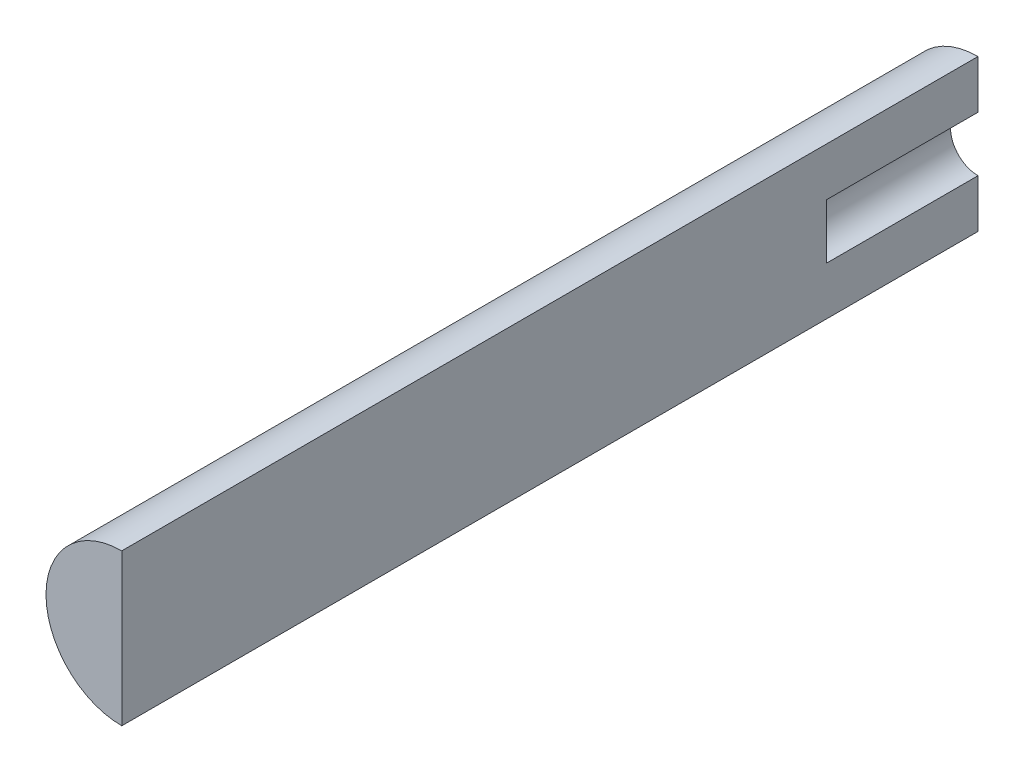
ISO-10303-21;
HEADER;
FILE_DESCRIPTION(('STEP AP214'),'2;1');
FILE_NAME('part.step','',(''),(''),'','','');
FILE_SCHEMA(('AUTOMOTIVE_DESIGN { 1 0 10303 214 1 1 1 1 }'));
ENDSEC;
DATA;
#1=APPLICATION_CONTEXT('core data for automotive mechanical design processes');
#2=APPLICATION_PROTOCOL_DEFINITION('international standard','automotive_design',2000,#1);
#3=PRODUCT_CONTEXT('',#1,'mechanical');
#4=PRODUCT('Part','Part','',(#3));
#5=PRODUCT_RELATED_PRODUCT_CATEGORY('part','',(#4));
#6=PRODUCT_DEFINITION_FORMATION('','',#4);
#7=PRODUCT_DEFINITION_CONTEXT('part definition',#1,'design');
#8=PRODUCT_DEFINITION('design','',#6,#7);
#9=PRODUCT_DEFINITION_SHAPE('','',#8);
#10=(LENGTH_UNIT() NAMED_UNIT(*) SI_UNIT(.MILLI.,.METRE.));
#11=(NAMED_UNIT(*) PLANE_ANGLE_UNIT() SI_UNIT($,.RADIAN.));
#12=(NAMED_UNIT(*) SI_UNIT($,.STERADIAN.) SOLID_ANGLE_UNIT());
#13=UNCERTAINTY_MEASURE_WITH_UNIT(LENGTH_MEASURE(1.E-05),#10,'distance_accuracy_value','');
#14=(GEOMETRIC_REPRESENTATION_CONTEXT(3) GLOBAL_UNCERTAINTY_ASSIGNED_CONTEXT((#13)) GLOBAL_UNIT_ASSIGNED_CONTEXT((#10,
#11,#12)) REPRESENTATION_CONTEXT('',''));
#15=CARTESIAN_POINT('',(0.,0.,0.));
#16=DIRECTION('',(0.,0.,1.));
#17=DIRECTION('',(1.,0.,0.));
#18=AXIS2_PLACEMENT_3D('',#15,#16,#17);
#19=CARTESIAN_POINT('',(0.,0.,45.2));
#20=DIRECTION('',(0.,0.,-1.));
#21=DIRECTION('',(-1.,0.,0.));
#22=AXIS2_PLACEMENT_3D('',#19,#20,#21);
#23=CYLINDRICAL_SURFACE('',#22,4.);
#24=CARTESIAN_POINT('',(0.,0.,45.2));
#25=DIRECTION('',(0.,0.,1.));
#26=DIRECTION('',(1.,0.,0.));
#27=AXIS2_PLACEMENT_3D('',#24,#25,#26);
#28=CIRCLE('',#27,4.);
#29=CARTESIAN_POINT('',(0.,4.,45.2));
#30=VERTEX_POINT('',#29);
#31=CARTESIAN_POINT('',(0.,-4.,45.2));
#32=VERTEX_POINT('',#31);
#33=EDGE_CURVE('E43',#30,#32,#28,.T.);
#34=ORIENTED_EDGE('',*,*,#33,.F.);
#35=DIRECTION('',(0.,0.,-1.));
#36=VECTOR('',#35,1.);
#37=CARTESIAN_POINT('',(0.,4.,60.));
#38=LINE('',#37,#36);
#39=CARTESIAN_POINT('',(0.,4.,0.));
#40=VERTEX_POINT('',#39);
#41=EDGE_CURVE('E80',#30,#40,#38,.T.);
#42=ORIENTED_EDGE('',*,*,#41,.T.);
#43=CARTESIAN_POINT('',(0.,0.,0.));
#44=DIRECTION('',(0.,0.,1.));
#45=DIRECTION('',(1.,0.,0.));
#46=AXIS2_PLACEMENT_3D('',#43,#44,#45);
#47=CIRCLE('',#46,4.);
#48=CARTESIAN_POINT('',(0.,-4.,0.));
#49=VERTEX_POINT('',#48);
#50=EDGE_CURVE('E87',#40,#49,#47,.T.);
#51=ORIENTED_EDGE('',*,*,#50,.T.);
#52=DIRECTION('',(0.,0.,-1.));
#53=VECTOR('',#52,1.);
#54=CARTESIAN_POINT('',(0.,-4.,60.));
#55=LINE('',#54,#53);
#56=EDGE_CURVE('E70',#32,#49,#55,.T.);
#57=ORIENTED_EDGE('',*,*,#56,.F.);
#58=EDGE_LOOP('',(#34,#42,#51,#57));
#59=FACE_BOUND('',#58,.T.);
#60=ADVANCED_FACE('F36',(#59),#23,.T.);
#61=CARTESIAN_POINT('',(0.,0.,45.2));
#62=DIRECTION('',(0.,0.,1.));
#63=DIRECTION('',(1.,0.,0.));
#64=AXIS2_PLACEMENT_3D('',#61,#62,#63);
#65=PLANE('',#64);
#66=DIRECTION('',(0.,-1.,0.));
#67=VECTOR('',#66,1.);
#68=CARTESIAN_POINT('',(0.,0.,45.2));
#69=LINE('',#68,#67);
#70=EDGE_CURVE('E75',#30,#32,#69,.T.);
#71=ORIENTED_EDGE('',*,*,#70,.F.);
#72=ORIENTED_EDGE('',*,*,#33,.T.);
#73=EDGE_LOOP('',(#71,#72));
#74=FACE_BOUND('',#73,.T.);
#75=ADVANCED_FACE('F117',(#74),#65,.T.);
#76=CARTESIAN_POINT('',(0.,0.,0.));
#77=DIRECTION('',(0.,0.,1.));
#78=DIRECTION('',(1.,0.,0.));
#79=AXIS2_PLACEMENT_3D('',#76,#77,#78);
#80=PLANE('',#79);
#81=ORIENTED_EDGE('',*,*,#50,.F.);
#82=DIRECTION('',(0.,1.,0.));
#83=VECTOR('',#82,1.);
#84=CARTESIAN_POINT('',(0.,-4.,0.));
#85=LINE('',#84,#83);
#86=CARTESIAN_POINT('',(0.,1.45,0.));
#87=VERTEX_POINT('',#86);
#88=EDGE_CURVE('E90',#87,#40,#85,.T.);
#89=ORIENTED_EDGE('',*,*,#88,.F.);
#90=CARTESIAN_POINT('',(0.,0.,0.));
#91=DIRECTION('',(0.,0.,-1.));
#92=DIRECTION('',(-1.,0.,0.));
#93=AXIS2_PLACEMENT_3D('',#90,#91,#92);
#94=CIRCLE('',#93,1.45);
#95=CARTESIAN_POINT('',(0.,-1.45,0.));
#96=VERTEX_POINT('',#95);
#97=EDGE_CURVE('E89',#96,#87,#94,.T.);
#98=ORIENTED_EDGE('',*,*,#97,.F.);
#99=EDGE_CURVE('E73',#49,#96,#85,.T.);
#100=ORIENTED_EDGE('',*,*,#99,.F.);
#101=EDGE_LOOP('',(#81,#89,#98,#100));
#102=FACE_BOUND('',#101,.T.);
#103=ADVANCED_FACE('F85',(#102),#80,.F.);
#104=CARTESIAN_POINT('',(0.,0.,8.));
#105=DIRECTION('',(0.,0.,-1.));
#106=DIRECTION('',(-1.,0.,0.));
#107=AXIS2_PLACEMENT_3D('',#104,#105,#106);
#108=CYLINDRICAL_SURFACE('',#107,1.45);
#109=ORIENTED_EDGE('',*,*,#97,.T.);
#110=DIRECTION('',(0.,0.,-1.));
#111=VECTOR('',#110,1.);
#112=CARTESIAN_POINT('',(0.,1.45,8.));
#113=LINE('',#112,#111);
#114=CARTESIAN_POINT('',(0.,1.45,8.));
#115=VERTEX_POINT('',#114);
#116=EDGE_CURVE('E100',#87,#115,#113,.F.);
#117=ORIENTED_EDGE('',*,*,#116,.T.);
#118=CARTESIAN_POINT('',(0.,0.,8.));
#119=DIRECTION('',(0.,0.,-1.));
#120=DIRECTION('',(-1.,0.,0.));
#121=AXIS2_PLACEMENT_3D('',#118,#119,#120);
#122=CIRCLE('',#121,1.45);
#123=CARTESIAN_POINT('',(0.,-1.45,8.));
#124=VERTEX_POINT('',#123);
#125=EDGE_CURVE('E93',#124,#115,#122,.T.);
#126=ORIENTED_EDGE('',*,*,#125,.F.);
#127=DIRECTION('',(0.,0.,-1.));
#128=VECTOR('',#127,1.);
#129=CARTESIAN_POINT('',(0.,-1.45,8.));
#130=LINE('',#129,#128);
#131=EDGE_CURVE('E49',#124,#96,#130,.T.);
#132=ORIENTED_EDGE('',*,*,#131,.T.);
#133=EDGE_LOOP('',(#109,#117,#126,#132));
#134=FACE_BOUND('',#133,.T.);
#135=ADVANCED_FACE('F105',(#134),#108,.F.);
#136=CARTESIAN_POINT('',(0.,0.,8.));
#137=DIRECTION('',(0.,0.,-1.));
#138=DIRECTION('',(-1.,0.,0.));
#139=AXIS2_PLACEMENT_3D('',#136,#137,#138);
#140=PLANE('',#139);
#141=DIRECTION('',(0.,1.,0.));
#142=VECTOR('',#141,1.);
#143=CARTESIAN_POINT('',(0.,0.,8.));
#144=LINE('',#143,#142);
#145=EDGE_CURVE('E11',#124,#115,#144,.T.);
#146=ORIENTED_EDGE('',*,*,#145,.F.);
#147=ORIENTED_EDGE('',*,*,#125,.T.);
#148=EDGE_LOOP('',(#146,#147));
#149=FACE_BOUND('',#148,.T.);
#150=ADVANCED_FACE('F107',(#149),#140,.T.);
#151=CARTESIAN_POINT('',(0.,-4.,60.));
#152=DIRECTION('',(-1.,0.,0.));
#153=DIRECTION('',(0.,0.,1.));
#154=AXIS2_PLACEMENT_3D('',#151,#152,#153);
#155=PLANE('',#154);
#156=ORIENTED_EDGE('',*,*,#70,.T.);
#157=ORIENTED_EDGE('',*,*,#56,.T.);
#158=ORIENTED_EDGE('',*,*,#99,.T.);
#159=ORIENTED_EDGE('',*,*,#131,.F.);
#160=ORIENTED_EDGE('',*,*,#145,.T.);
#161=ORIENTED_EDGE('',*,*,#116,.F.);
#162=ORIENTED_EDGE('',*,*,#88,.T.);
#163=ORIENTED_EDGE('',*,*,#41,.F.);
#164=EDGE_LOOP('',(#156,#157,#158,#159,#160,#161,#162,#163));
#165=FACE_BOUND('',#164,.T.);
#166=ADVANCED_FACE('F72',(#165),#155,.F.);
#167=CLOSED_SHELL('',(#60,#75,#103,#135,#150,#166));
#168=MANIFOLD_SOLID_BREP('B2',#167);
#169=ADVANCED_BREP_SHAPE_REPRESENTATION('',(#18,#168),#14);
#170=SHAPE_DEFINITION_REPRESENTATION(#9,#169);
ENDSEC;
END-ISO-10303-21;
